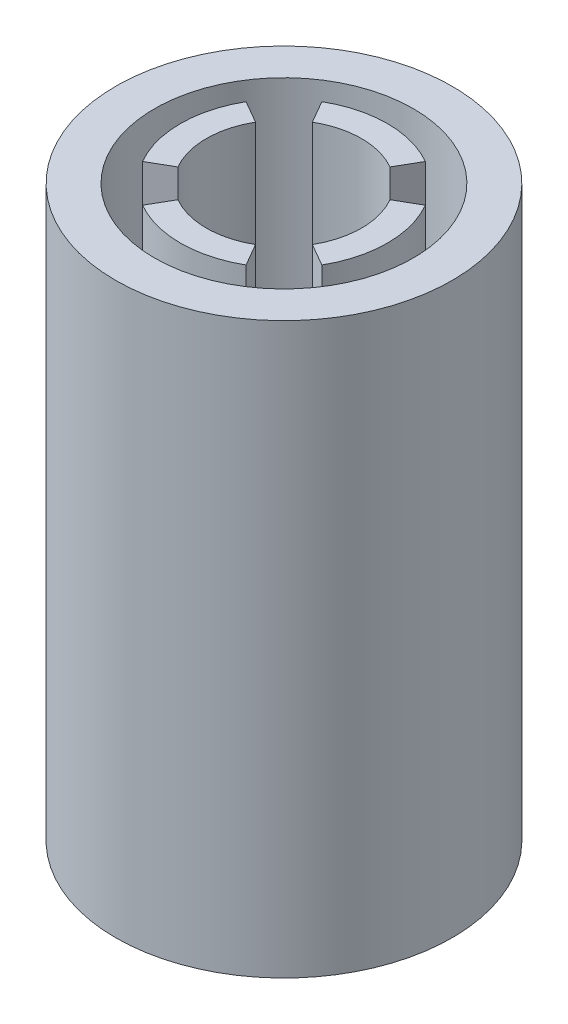
ISO-10303-21;
HEADER;
FILE_DESCRIPTION(('STEP AP214'),'2;1');
FILE_NAME('part.step','',(''),(''),'','','');
FILE_SCHEMA(('AUTOMOTIVE_DESIGN { 1 0 10303 214 1 1 1 1 }'));
ENDSEC;
DATA;
#1=APPLICATION_CONTEXT('core data for automotive mechanical design processes');
#2=APPLICATION_PROTOCOL_DEFINITION('international standard','automotive_design',2000,#1);
#3=PRODUCT_CONTEXT('',#1,'mechanical');
#4=PRODUCT('Part','Part','',(#3));
#5=PRODUCT_RELATED_PRODUCT_CATEGORY('part','',(#4));
#6=PRODUCT_DEFINITION_FORMATION('','',#4);
#7=PRODUCT_DEFINITION_CONTEXT('part definition',#1,'design');
#8=PRODUCT_DEFINITION('design','',#6,#7);
#9=PRODUCT_DEFINITION_SHAPE('','',#8);
#10=(LENGTH_UNIT() NAMED_UNIT(*) SI_UNIT(.MILLI.,.METRE.));
#11=(NAMED_UNIT(*) PLANE_ANGLE_UNIT() SI_UNIT($,.RADIAN.));
#12=(NAMED_UNIT(*) SI_UNIT($,.STERADIAN.) SOLID_ANGLE_UNIT());
#13=UNCERTAINTY_MEASURE_WITH_UNIT(LENGTH_MEASURE(1.E-05),#10,'distance_accuracy_value','');
#14=(GEOMETRIC_REPRESENTATION_CONTEXT(3) GLOBAL_UNCERTAINTY_ASSIGNED_CONTEXT((#13)) GLOBAL_UNIT_ASSIGNED_CONTEXT((#10,
#11,#12)) REPRESENTATION_CONTEXT('',''));
#15=CARTESIAN_POINT('',(0.,0.,0.));
#16=DIRECTION('',(0.,0.,1.));
#17=DIRECTION('',(1.,0.,0.));
#18=AXIS2_PLACEMENT_3D('',#15,#16,#17);
#19=CARTESIAN_POINT('',(0.,22.,0.));
#20=DIRECTION('',(0.,1.,0.));
#21=DIRECTION('',(0.,0.,1.));
#22=AXIS2_PLACEMENT_3D('',#19,#20,#21);
#23=PLANE('',#22);
#24=CARTESIAN_POINT('',(0.,22.,0.));
#25=DIRECTION('',(0.,1.,0.));
#26=DIRECTION('',(0.,0.,1.));
#27=AXIS2_PLACEMENT_3D('',#24,#25,#26);
#28=CIRCLE('',#27,6.5);
#29=CARTESIAN_POINT('',(0.,22.,6.5));
#30=VERTEX_POINT('',#29);
#31=EDGE_CURVE('E11',#30,#30,#28,.T.);
#32=ORIENTED_EDGE('',*,*,#31,.T.);
#33=EDGE_LOOP('',(#32));
#34=FACE_BOUND('',#33,.T.);
#35=CARTESIAN_POINT('',(0.,22.,0.));
#36=DIRECTION('',(0.,1.,0.));
#37=DIRECTION('',(0.,0.,1.));
#38=AXIS2_PLACEMENT_3D('',#35,#36,#37);
#39=CIRCLE('',#38,5.);
#40=CARTESIAN_POINT('',(0.,22.,5.));
#41=VERTEX_POINT('',#40);
#42=EDGE_CURVE('E351',#41,#41,#39,.T.);
#43=ORIENTED_EDGE('',*,*,#42,.F.);
#44=EDGE_LOOP('',(#43));
#45=FACE_BOUND('',#44,.T.);
#46=ADVANCED_FACE('F45',(#34,#45),#23,.T.);
#47=CARTESIAN_POINT('',(0.,22.,0.));
#48=DIRECTION('',(0.,-1.,0.));
#49=DIRECTION('',(0.,0.,-1.));
#50=AXIS2_PLACEMENT_3D('',#47,#48,#49);
#51=CYLINDRICAL_SURFACE('',#50,6.5);
#52=ORIENTED_EDGE('',*,*,#31,.F.);
#53=EDGE_LOOP('',(#52));
#54=FACE_BOUND('',#53,.T.);
#55=CARTESIAN_POINT('',(0.,0.,0.));
#56=DIRECTION('',(0.,1.,0.));
#57=DIRECTION('',(0.,0.,1.));
#58=AXIS2_PLACEMENT_3D('',#55,#56,#57);
#59=CIRCLE('',#58,6.5);
#60=CARTESIAN_POINT('',(0.,0.,6.5));
#61=VERTEX_POINT('',#60);
#62=EDGE_CURVE('E49',#61,#61,#59,.T.);
#63=ORIENTED_EDGE('',*,*,#62,.T.);
#64=EDGE_LOOP('',(#63));
#65=FACE_BOUND('',#64,.T.);
#66=ADVANCED_FACE('F47',(#54,#65),#51,.T.);
#67=CARTESIAN_POINT('',(0.,0.,0.));
#68=DIRECTION('',(0.,1.,0.));
#69=DIRECTION('',(0.,0.,1.));
#70=AXIS2_PLACEMENT_3D('',#67,#68,#69);
#71=PLANE('',#70);
#72=CARTESIAN_POINT('',(0.,0.,-4.5));
#73=DIRECTION('',(0.,1.,0.));
#74=DIRECTION('',(0.,0.,1.));
#75=AXIS2_PLACEMENT_3D('',#72,#73,#74);
#76=CIRCLE('',#75,0.3);
#77=CARTESIAN_POINT('',(0.,0.,-4.2));
#78=VERTEX_POINT('',#77);
#79=EDGE_CURVE('E614',#78,#78,#76,.T.);
#80=ORIENTED_EDGE('',*,*,#79,.T.);
#81=EDGE_LOOP('',(#80));
#82=FACE_BOUND('',#81,.T.);
#83=CARTESIAN_POINT('',(4.5,0.,0.));
#84=DIRECTION('',(0.,1.,0.));
#85=DIRECTION('',(0.,0.,1.));
#86=AXIS2_PLACEMENT_3D('',#83,#84,#85);
#87=CIRCLE('',#86,0.3);
#88=CARTESIAN_POINT('',(4.5,0.,0.3));
#89=VERTEX_POINT('',#88);
#90=EDGE_CURVE('E626',#89,#89,#87,.T.);
#91=ORIENTED_EDGE('',*,*,#90,.T.);
#92=EDGE_LOOP('',(#91));
#93=FACE_BOUND('',#92,.T.);
#94=CARTESIAN_POINT('',(0.,0.,4.5));
#95=DIRECTION('',(0.,1.,0.));
#96=DIRECTION('',(0.,0.,1.));
#97=AXIS2_PLACEMENT_3D('',#94,#95,#96);
#98=CIRCLE('',#97,0.3);
#99=CARTESIAN_POINT('',(0.,0.,4.8));
#100=VERTEX_POINT('',#99);
#101=EDGE_CURVE('E636',#100,#100,#98,.T.);
#102=ORIENTED_EDGE('',*,*,#101,.T.);
#103=EDGE_LOOP('',(#102));
#104=FACE_BOUND('',#103,.T.);
#105=CARTESIAN_POINT('',(-4.5,0.,0.));
#106=DIRECTION('',(0.,1.,0.));
#107=DIRECTION('',(0.,0.,1.));
#108=AXIS2_PLACEMENT_3D('',#105,#106,#107);
#109=CIRCLE('',#108,0.3);
#110=CARTESIAN_POINT('',(-4.5,0.,0.300000000000001));
#111=VERTEX_POINT('',#110);
#112=EDGE_CURVE('E644',#111,#111,#109,.T.);
#113=ORIENTED_EDGE('',*,*,#112,.T.);
#114=EDGE_LOOP('',(#113));
#115=FACE_BOUND('',#114,.T.);
#116=ORIENTED_EDGE('',*,*,#62,.F.);
#117=EDGE_LOOP('',(#116));
#118=FACE_BOUND('',#117,.T.);
#119=ADVANCED_FACE('F374',(#82,#93,#104,#115,#118),#71,.F.);
#120=CARTESIAN_POINT('',(0.,2.,0.));
#121=DIRECTION('',(0.,1.,0.));
#122=DIRECTION('',(0.,0.,1.));
#123=AXIS2_PLACEMENT_3D('',#120,#121,#122);
#124=PLANE('',#123);
#125=CARTESIAN_POINT('',(0.,2.,-4.5));
#126=DIRECTION('',(0.,1.,0.));
#127=DIRECTION('',(0.,0.,1.));
#128=AXIS2_PLACEMENT_3D('',#125,#126,#127);
#129=CIRCLE('',#128,0.3);
#130=CARTESIAN_POINT('',(0.,2.,-4.2));
#131=VERTEX_POINT('',#130);
#132=EDGE_CURVE('E617',#131,#131,#129,.T.);
#133=ORIENTED_EDGE('',*,*,#132,.F.);
#134=EDGE_LOOP('',(#133));
#135=FACE_BOUND('',#134,.T.);
#136=CARTESIAN_POINT('',(4.5,2.,0.));
#137=DIRECTION('',(0.,1.,0.));
#138=DIRECTION('',(0.,0.,1.));
#139=AXIS2_PLACEMENT_3D('',#136,#137,#138);
#140=CIRCLE('',#139,0.3);
#141=CARTESIAN_POINT('',(4.5,2.,0.3));
#142=VERTEX_POINT('',#141);
#143=EDGE_CURVE('E619',#142,#142,#140,.T.);
#144=ORIENTED_EDGE('',*,*,#143,.F.);
#145=EDGE_LOOP('',(#144));
#146=FACE_BOUND('',#145,.T.);
#147=CARTESIAN_POINT('',(0.,2.,4.5));
#148=DIRECTION('',(0.,1.,0.));
#149=DIRECTION('',(0.,0.,1.));
#150=AXIS2_PLACEMENT_3D('',#147,#148,#149);
#151=CIRCLE('',#150,0.3);
#152=CARTESIAN_POINT('',(0.,2.,4.8));
#153=VERTEX_POINT('',#152);
#154=EDGE_CURVE('E632',#153,#153,#151,.T.);
#155=ORIENTED_EDGE('',*,*,#154,.F.);
#156=EDGE_LOOP('',(#155));
#157=FACE_BOUND('',#156,.T.);
#158=CARTESIAN_POINT('',(-4.5,2.,0.));
#159=DIRECTION('',(0.,1.,0.));
#160=DIRECTION('',(0.,0.,1.));
#161=AXIS2_PLACEMENT_3D('',#158,#159,#160);
#162=CIRCLE('',#161,0.3);
#163=CARTESIAN_POINT('',(-4.5,2.,0.300000000000001));
#164=VERTEX_POINT('',#163);
#165=EDGE_CURVE('E640',#164,#164,#162,.T.);
#166=ORIENTED_EDGE('',*,*,#165,.F.);
#167=EDGE_LOOP('',(#166));
#168=FACE_BOUND('',#167,.T.);
#169=CARTESIAN_POINT('',(0.,2.,0.));
#170=DIRECTION('',(0.,-1.,0.));
#171=DIRECTION('',(0.,0.,-1.));
#172=AXIS2_PLACEMENT_3D('',#169,#170,#171);
#173=CIRCLE('',#172,0.75);
#174=CARTESIAN_POINT('',(0.,2.,-0.75));
#175=VERTEX_POINT('',#174);
#176=EDGE_CURVE('E623',#175,#175,#173,.T.);
#177=ORIENTED_EDGE('',*,*,#176,.T.);
#178=EDGE_LOOP('',(#177));
#179=FACE_BOUND('',#178,.T.);
#180=CARTESIAN_POINT('',(0.,2.,0.));
#181=DIRECTION('',(0.,-1.,0.));
#182=DIRECTION('',(0.,0.,-1.));
#183=AXIS2_PLACEMENT_3D('',#180,#181,#182);
#184=CIRCLE('',#183,3.);
#185=CARTESIAN_POINT('',(-2.59807621135326,2.,1.50000000000009));
#186=VERTEX_POINT('',#185);
#187=CARTESIAN_POINT('',(-2.59807621135337,2.,-1.49999999999991));
#188=VERTEX_POINT('',#187);
#189=EDGE_CURVE('E172',#186,#188,#184,.T.);
#190=ORIENTED_EDGE('',*,*,#189,.F.);
#191=DIRECTION('',(0.86602540378449,0.,-0.499999999999911));
#192=VECTOR('',#191,1.);
#193=CARTESIAN_POINT('',(-3.46410161513775,2.,2.));
#194=LINE('',#193,#192);
#195=CARTESIAN_POINT('',(-3.46410161513775,2.,2.));
#196=VERTEX_POINT('',#195);
#197=EDGE_CURVE('E224',#196,#186,#194,.T.);
#198=ORIENTED_EDGE('',*,*,#197,.F.);
#199=CARTESIAN_POINT('',(0.,2.,0.));
#200=DIRECTION('',(0.,1.,0.));
#201=DIRECTION('',(0.,0.,-1.));
#202=AXIS2_PLACEMENT_3D('',#199,#200,#201);
#203=CIRCLE('',#202,4.);
#204=CARTESIAN_POINT('',(-3.46410161513775,2.,-2.));
#205=VERTEX_POINT('',#204);
#206=EDGE_CURVE('E244',#205,#196,#203,.T.);
#207=ORIENTED_EDGE('',*,*,#206,.F.);
#208=DIRECTION('',(-0.866025403784386,0.,-0.500000000000092));
#209=VECTOR('',#208,1.);
#210=CARTESIAN_POINT('',(-2.59807621135337,2.,-1.49999999999991));
#211=LINE('',#210,#209);
#212=EDGE_CURVE('E240',#188,#205,#211,.T.);
#213=ORIENTED_EDGE('',*,*,#212,.F.);
#214=EDGE_LOOP('',(#190,#198,#207,#213));
#215=FACE_BOUND('',#214,.T.);
#216=CARTESIAN_POINT('',(0.,2.,0.));
#217=DIRECTION('',(0.,-1.,0.));
#218=DIRECTION('',(0.,0.,-1.));
#219=AXIS2_PLACEMENT_3D('',#216,#217,#218);
#220=CIRCLE('',#219,3.);
#221=CARTESIAN_POINT('',(-1.5,2.,-2.59807621135331));
#222=VERTEX_POINT('',#221);
#223=CARTESIAN_POINT('',(1.5,2.,-2.59807621135331));
#224=VERTEX_POINT('',#223);
#225=EDGE_CURVE('E307',#222,#224,#220,.T.);
#226=ORIENTED_EDGE('',*,*,#225,.F.);
#227=DIRECTION('',(0.500000000000001,0.,0.866025403784438));
#228=VECTOR('',#227,1.);
#229=CARTESIAN_POINT('',(-2.,2.,-3.46410161513775));
#230=LINE('',#229,#228);
#231=CARTESIAN_POINT('',(-2.,2.,-3.46410161513775));
#232=VERTEX_POINT('',#231);
#233=EDGE_CURVE('E311',#232,#222,#230,.T.);
#234=ORIENTED_EDGE('',*,*,#233,.F.);
#235=CARTESIAN_POINT('',(0.,2.,0.));
#236=DIRECTION('',(0.,1.,0.));
#237=DIRECTION('',(0.,0.,-1.));
#238=AXIS2_PLACEMENT_3D('',#235,#236,#237);
#239=CIRCLE('',#238,4.);
#240=CARTESIAN_POINT('',(2.,2.,-3.46410161513775));
#241=VERTEX_POINT('',#240);
#242=EDGE_CURVE('E331',#241,#232,#239,.T.);
#243=ORIENTED_EDGE('',*,*,#242,.F.);
#244=DIRECTION('',(0.500000000000001,0.,-0.866025403784438));
#245=VECTOR('',#244,1.);
#246=CARTESIAN_POINT('',(1.5,2.,-2.59807621135331));
#247=LINE('',#246,#245);
#248=EDGE_CURVE('E327',#224,#241,#247,.T.);
#249=ORIENTED_EDGE('',*,*,#248,.F.);
#250=EDGE_LOOP('',(#226,#234,#243,#249));
#251=FACE_BOUND('',#250,.T.);
#252=CARTESIAN_POINT('',(0.,2.,0.));
#253=DIRECTION('',(0.,1.,0.));
#254=DIRECTION('',(0.,0.,1.));
#255=AXIS2_PLACEMENT_3D('',#252,#253,#254);
#256=CIRCLE('',#255,5.);
#257=CARTESIAN_POINT('',(0.,2.,5.));
#258=VERTEX_POINT('',#257);
#259=EDGE_CURVE('E350',#258,#258,#256,.T.);
#260=ORIENTED_EDGE('',*,*,#259,.T.);
#261=EDGE_LOOP('',(#260));
#262=FACE_BOUND('',#261,.T.);
#263=CARTESIAN_POINT('',(0.,2.,0.));
#264=DIRECTION('',(0.,-1.,0.));
#265=DIRECTION('',(0.,0.,-1.));
#266=AXIS2_PLACEMENT_3D('',#263,#264,#265);
#267=CIRCLE('',#266,3.);
#268=CARTESIAN_POINT('',(2.59807621135333,2.,-1.49999999999997));
#269=VERTEX_POINT('',#268);
#270=CARTESIAN_POINT('',(2.5980762113533,2.,1.50000000000003));
#271=VERTEX_POINT('',#270);
#272=EDGE_CURVE('E264',#269,#271,#267,.T.);
#273=ORIENTED_EDGE('',*,*,#272,.F.);
#274=DIRECTION('',(-0.866025403784443,0.,0.499999999999992));
#275=VECTOR('',#274,1.);
#276=CARTESIAN_POINT('',(3.46410161513777,2.,-1.99999999999996));
#277=LINE('',#276,#275);
#278=CARTESIAN_POINT('',(3.46410161513777,2.,-1.99999999999996));
#279=VERTEX_POINT('',#278);
#280=EDGE_CURVE('E268',#279,#269,#277,.T.);
#281=ORIENTED_EDGE('',*,*,#280,.F.);
#282=CARTESIAN_POINT('',(0.,2.,0.));
#283=DIRECTION('',(0.,1.,0.));
#284=DIRECTION('',(0.,0.,-1.));
#285=AXIS2_PLACEMENT_3D('',#282,#283,#284);
#286=CIRCLE('',#285,4.);
#287=CARTESIAN_POINT('',(3.46410161513773,2.,2.00000000000004));
#288=VERTEX_POINT('',#287);
#289=EDGE_CURVE('E288',#288,#279,#286,.T.);
#290=ORIENTED_EDGE('',*,*,#289,.F.);
#291=DIRECTION('',(0.866025403784432,0.,0.500000000000011));
#292=VECTOR('',#291,1.);
#293=CARTESIAN_POINT('',(2.5980762113533,2.,1.50000000000003));
#294=LINE('',#293,#292);
#295=EDGE_CURVE('E284',#271,#288,#294,.T.);
#296=ORIENTED_EDGE('',*,*,#295,.F.);
#297=EDGE_LOOP('',(#273,#281,#290,#296));
#298=FACE_BOUND('',#297,.T.);
#299=CARTESIAN_POINT('',(0.,2.,0.));
#300=DIRECTION('',(0.,-1.,0.));
#301=DIRECTION('',(0.,0.,-1.));
#302=AXIS2_PLACEMENT_3D('',#299,#300,#301);
#303=CIRCLE('',#302,3.);
#304=CARTESIAN_POINT('',(1.50000000000002,2.,2.5980762113533));
#305=VERTEX_POINT('',#304);
#306=CARTESIAN_POINT('',(-1.49999999999998,2.,2.59807621135333));
#307=VERTEX_POINT('',#306);
#308=EDGE_CURVE('E168',#305,#307,#303,.T.);
#309=ORIENTED_EDGE('',*,*,#308,.F.);
#310=DIRECTION('',(-0.500000000000008,0.,-0.866025403784434));
#311=VECTOR('',#310,1.);
#312=CARTESIAN_POINT('',(2.00000000000003,2.,3.46410161513774));
#313=LINE('',#312,#311);
#314=CARTESIAN_POINT('',(2.00000000000003,2.,3.46410161513774));
#315=VERTEX_POINT('',#314);
#316=EDGE_CURVE('E189',#315,#305,#313,.T.);
#317=ORIENTED_EDGE('',*,*,#316,.F.);
#318=CARTESIAN_POINT('',(0.,2.,0.));
#319=DIRECTION('',(0.,1.,0.));
#320=DIRECTION('',(0.,0.,-1.));
#321=AXIS2_PLACEMENT_3D('',#318,#319,#320);
#322=CIRCLE('',#321,4.);
#323=CARTESIAN_POINT('',(-1.99999999999998,2.,3.46410161513777));
#324=VERTEX_POINT('',#323);
#325=EDGE_CURVE('E193',#324,#315,#322,.T.);
#326=ORIENTED_EDGE('',*,*,#325,.F.);
#327=DIRECTION('',(-0.499999999999994,0.,0.866025403784442));
#328=VECTOR('',#327,1.);
#329=CARTESIAN_POINT('',(-1.49999999999998,2.,2.59807621135333));
#330=LINE('',#329,#328);
#331=EDGE_CURVE('E206',#307,#324,#330,.T.);
#332=ORIENTED_EDGE('',*,*,#331,.F.);
#333=EDGE_LOOP('',(#309,#317,#326,#332));
#334=FACE_BOUND('',#333,.T.);
#335=ADVANCED_FACE('F359',(#135,#146,#157,#168,#179,#215,#251,#262,#298,#334),#124,.T.);
#336=CARTESIAN_POINT('',(0.,22.,0.));
#337=DIRECTION('',(0.,-1.,0.));
#338=DIRECTION('',(0.,0.,-1.));
#339=AXIS2_PLACEMENT_3D('',#336,#337,#338);
#340=CYLINDRICAL_SURFACE('',#339,5.);
#341=ORIENTED_EDGE('',*,*,#42,.T.);
#342=EDGE_LOOP('',(#341));
#343=FACE_BOUND('',#342,.T.);
#344=ORIENTED_EDGE('',*,*,#259,.F.);
#345=EDGE_LOOP('',(#344));
#346=FACE_BOUND('',#345,.T.);
#347=ADVANCED_FACE('F362',(#343,#346),#340,.F.);
#348=CARTESIAN_POINT('',(0.,22.,0.));
#349=DIRECTION('',(0.,-1.,0.));
#350=DIRECTION('',(0.,0.,-1.));
#351=AXIS2_PLACEMENT_3D('',#348,#349,#350);
#352=CYLINDRICAL_SURFACE('',#351,3.);
#353=ORIENTED_EDGE('',*,*,#225,.T.);
#354=DIRECTION('',(0.,-1.,0.));
#355=VECTOR('',#354,1.);
#356=CARTESIAN_POINT('',(1.5,22.,-2.59807621135331));
#357=LINE('',#356,#355);
#358=CARTESIAN_POINT('',(1.5,22.,-2.59807621135331));
#359=VERTEX_POINT('',#358);
#360=EDGE_CURVE('E346',#359,#224,#357,.T.);
#361=ORIENTED_EDGE('',*,*,#360,.F.);
#362=CARTESIAN_POINT('',(0.,22.,0.));
#363=DIRECTION('',(0.,-1.,0.));
#364=DIRECTION('',(0.,0.,-1.));
#365=AXIS2_PLACEMENT_3D('',#362,#363,#364);
#366=CIRCLE('',#365,3.);
#367=CARTESIAN_POINT('',(-1.5,22.,-2.59807621135331));
#368=VERTEX_POINT('',#367);
#369=EDGE_CURVE('E61',#368,#359,#366,.T.);
#370=ORIENTED_EDGE('',*,*,#369,.F.);
#371=DIRECTION('',(0.,-1.,0.));
#372=VECTOR('',#371,1.);
#373=CARTESIAN_POINT('',(-1.5,22.,-2.59807621135331));
#374=LINE('',#373,#372);
#375=EDGE_CURVE('E323',#368,#222,#374,.T.);
#376=ORIENTED_EDGE('',*,*,#375,.T.);
#377=EDGE_LOOP('',(#353,#361,#370,#376));
#378=FACE_BOUND('',#377,.T.);
#379=ADVANCED_FACE('F364',(#378),#352,.F.);
#380=CARTESIAN_POINT('',(1.5,22.,-2.59807621135331));
#381=DIRECTION('',(-0.866025403784438,0.,-0.500000000000001));
#382=DIRECTION('',(-0.500000000000001,0.,0.866025403784438));
#383=AXIS2_PLACEMENT_3D('',#380,#381,#382);
#384=PLANE('',#383);
#385=ORIENTED_EDGE('',*,*,#248,.T.);
#386=DIRECTION('',(0.,-1.,0.));
#387=VECTOR('',#386,1.);
#388=CARTESIAN_POINT('',(2.,22.,-3.46410161513775));
#389=LINE('',#388,#387);
#390=CARTESIAN_POINT('',(2.,22.,-3.46410161513775));
#391=VERTEX_POINT('',#390);
#392=EDGE_CURVE('E343',#391,#241,#389,.T.);
#393=ORIENTED_EDGE('',*,*,#392,.F.);
#394=DIRECTION('',(0.500000000000001,0.,-0.866025403784438));
#395=VECTOR('',#394,1.);
#396=CARTESIAN_POINT('',(1.5,22.,-2.59807621135331));
#397=LINE('',#396,#395);
#398=EDGE_CURVE('E310',#359,#391,#397,.T.);
#399=ORIENTED_EDGE('',*,*,#398,.F.);
#400=ORIENTED_EDGE('',*,*,#360,.T.);
#401=EDGE_LOOP('',(#385,#393,#399,#400));
#402=FACE_BOUND('',#401,.T.);
#403=ADVANCED_FACE('F371',(#402),#384,.F.);
#404=CARTESIAN_POINT('',(0.,22.,0.));
#405=DIRECTION('',(0.,-1.,0.));
#406=DIRECTION('',(0.,0.,-1.));
#407=AXIS2_PLACEMENT_3D('',#404,#405,#406);
#408=CYLINDRICAL_SURFACE('',#407,4.);
#409=ORIENTED_EDGE('',*,*,#242,.T.);
#410=DIRECTION('',(0.,-1.,0.));
#411=VECTOR('',#410,1.);
#412=CARTESIAN_POINT('',(-2.,22.,-3.46410161513775));
#413=LINE('',#412,#411);
#414=CARTESIAN_POINT('',(-2.,22.,-3.46410161513775));
#415=VERTEX_POINT('',#414);
#416=EDGE_CURVE('E340',#415,#232,#413,.T.);
#417=ORIENTED_EDGE('',*,*,#416,.F.);
#418=CARTESIAN_POINT('',(0.,22.,0.));
#419=DIRECTION('',(0.,1.,0.));
#420=DIRECTION('',(0.,0.,-1.));
#421=AXIS2_PLACEMENT_3D('',#418,#419,#420);
#422=CIRCLE('',#421,4.);
#423=EDGE_CURVE('E315',#391,#415,#422,.T.);
#424=ORIENTED_EDGE('',*,*,#423,.F.);
#425=ORIENTED_EDGE('',*,*,#392,.T.);
#426=EDGE_LOOP('',(#409,#417,#424,#425));
#427=FACE_BOUND('',#426,.T.);
#428=ADVANCED_FACE('F453',(#427),#408,.T.);
#429=CARTESIAN_POINT('',(-2.,22.,-3.46410161513775));
#430=DIRECTION('',(0.866025403784438,0.,-0.500000000000001));
#431=DIRECTION('',(-0.500000000000001,0.,-0.866025403784438));
#432=AXIS2_PLACEMENT_3D('',#429,#430,#431);
#433=PLANE('',#432);
#434=ORIENTED_EDGE('',*,*,#233,.T.);
#435=ORIENTED_EDGE('',*,*,#375,.F.);
#436=DIRECTION('',(0.500000000000001,0.,0.866025403784438));
#437=VECTOR('',#436,1.);
#438=CARTESIAN_POINT('',(-2.,22.,-3.46410161513775));
#439=LINE('',#438,#437);
#440=EDGE_CURVE('E319',#415,#368,#439,.T.);
#441=ORIENTED_EDGE('',*,*,#440,.F.);
#442=ORIENTED_EDGE('',*,*,#416,.T.);
#443=EDGE_LOOP('',(#434,#435,#441,#442));
#444=FACE_BOUND('',#443,.T.);
#445=ADVANCED_FACE('F450',(#444),#433,.F.);
#446=CARTESIAN_POINT('',(0.,22.,0.));
#447=DIRECTION('',(0.,-1.,0.));
#448=DIRECTION('',(0.,0.,-1.));
#449=AXIS2_PLACEMENT_3D('',#446,#447,#448);
#450=CYLINDRICAL_SURFACE('',#449,3.);
#451=ORIENTED_EDGE('',*,*,#272,.T.);
#452=DIRECTION('',(0.,-1.,0.));
#453=VECTOR('',#452,1.);
#454=CARTESIAN_POINT('',(2.5980762113533,22.,1.50000000000003));
#455=LINE('',#454,#453);
#456=CARTESIAN_POINT('',(2.5980762113533,22.,1.50000000000003));
#457=VERTEX_POINT('',#456);
#458=EDGE_CURVE('E303',#457,#271,#455,.T.);
#459=ORIENTED_EDGE('',*,*,#458,.F.);
#460=CARTESIAN_POINT('',(0.,22.,0.));
#461=DIRECTION('',(0.,-1.,0.));
#462=DIRECTION('',(0.,0.,-1.));
#463=AXIS2_PLACEMENT_3D('',#460,#461,#462);
#464=CIRCLE('',#463,3.);
#465=CARTESIAN_POINT('',(2.59807621135333,22.,-1.49999999999997));
#466=VERTEX_POINT('',#465);
#467=EDGE_CURVE('E69',#466,#457,#464,.T.);
#468=ORIENTED_EDGE('',*,*,#467,.F.);
#469=DIRECTION('',(0.,-1.,0.));
#470=VECTOR('',#469,1.);
#471=CARTESIAN_POINT('',(2.59807621135333,22.,-1.49999999999997));
#472=LINE('',#471,#470);
#473=EDGE_CURVE('E280',#466,#269,#472,.T.);
#474=ORIENTED_EDGE('',*,*,#473,.T.);
#475=EDGE_LOOP('',(#451,#459,#468,#474));
#476=FACE_BOUND('',#475,.T.);
#477=ADVANCED_FACE('F446',(#476),#450,.F.);
#478=CARTESIAN_POINT('',(2.5980762113533,22.,1.50000000000003));
#479=DIRECTION('',(0.500000000000011,0.,-0.866025403784432));
#480=DIRECTION('',(-0.866025403784432,0.,-0.500000000000011));
#481=AXIS2_PLACEMENT_3D('',#478,#479,#480);
#482=PLANE('',#481);
#483=ORIENTED_EDGE('',*,*,#295,.T.);
#484=DIRECTION('',(0.,-1.,0.));
#485=VECTOR('',#484,1.);
#486=CARTESIAN_POINT('',(3.46410161513773,22.,2.00000000000004));
#487=LINE('',#486,#485);
#488=CARTESIAN_POINT('',(3.46410161513773,22.,2.00000000000004));
#489=VERTEX_POINT('',#488);
#490=EDGE_CURVE('E300',#489,#288,#487,.T.);
#491=ORIENTED_EDGE('',*,*,#490,.F.);
#492=DIRECTION('',(0.866025403784432,0.,0.500000000000011));
#493=VECTOR('',#492,1.);
#494=CARTESIAN_POINT('',(2.5980762113533,22.,1.50000000000003));
#495=LINE('',#494,#493);
#496=EDGE_CURVE('E267',#457,#489,#495,.T.);
#497=ORIENTED_EDGE('',*,*,#496,.F.);
#498=ORIENTED_EDGE('',*,*,#458,.T.);
#499=EDGE_LOOP('',(#483,#491,#497,#498));
#500=FACE_BOUND('',#499,.T.);
#501=ADVANCED_FACE('F442',(#500),#482,.F.);
#502=CARTESIAN_POINT('',(0.,22.,0.));
#503=DIRECTION('',(0.,-1.,0.));
#504=DIRECTION('',(0.,0.,-1.));
#505=AXIS2_PLACEMENT_3D('',#502,#503,#504);
#506=CYLINDRICAL_SURFACE('',#505,4.);
#507=ORIENTED_EDGE('',*,*,#289,.T.);
#508=DIRECTION('',(0.,-1.,0.));
#509=VECTOR('',#508,1.);
#510=CARTESIAN_POINT('',(3.46410161513777,22.,-1.99999999999996));
#511=LINE('',#510,#509);
#512=CARTESIAN_POINT('',(3.46410161513777,22.,-1.99999999999996));
#513=VERTEX_POINT('',#512);
#514=EDGE_CURVE('E297',#513,#279,#511,.T.);
#515=ORIENTED_EDGE('',*,*,#514,.F.);
#516=CARTESIAN_POINT('',(0.,22.,0.));
#517=DIRECTION('',(0.,1.,0.));
#518=DIRECTION('',(0.,0.,-1.));
#519=AXIS2_PLACEMENT_3D('',#516,#517,#518);
#520=CIRCLE('',#519,4.);
#521=EDGE_CURVE('E272',#489,#513,#520,.T.);
#522=ORIENTED_EDGE('',*,*,#521,.F.);
#523=ORIENTED_EDGE('',*,*,#490,.T.);
#524=EDGE_LOOP('',(#507,#515,#522,#523));
#525=FACE_BOUND('',#524,.T.);
#526=ADVANCED_FACE('F438',(#525),#506,.T.);
#527=CARTESIAN_POINT('',(3.46410161513777,22.,-1.99999999999996));
#528=DIRECTION('',(0.499999999999992,0.,0.866025403784443));
#529=DIRECTION('',(0.866025403784443,0.,-0.499999999999992));
#530=AXIS2_PLACEMENT_3D('',#527,#528,#529);
#531=PLANE('',#530);
#532=ORIENTED_EDGE('',*,*,#280,.T.);
#533=ORIENTED_EDGE('',*,*,#473,.F.);
#534=DIRECTION('',(-0.866025403784443,0.,0.499999999999992));
#535=VECTOR('',#534,1.);
#536=CARTESIAN_POINT('',(3.46410161513777,22.,-1.99999999999996));
#537=LINE('',#536,#535);
#538=EDGE_CURVE('E276',#513,#466,#537,.T.);
#539=ORIENTED_EDGE('',*,*,#538,.F.);
#540=ORIENTED_EDGE('',*,*,#514,.T.);
#541=EDGE_LOOP('',(#532,#533,#539,#540));
#542=FACE_BOUND('',#541,.T.);
#543=ADVANCED_FACE('F432',(#542),#531,.F.);
#544=CARTESIAN_POINT('',(0.,22.,0.));
#545=DIRECTION('',(0.,-1.,0.));
#546=DIRECTION('',(0.,0.,-1.));
#547=AXIS2_PLACEMENT_3D('',#544,#545,#546);
#548=CYLINDRICAL_SURFACE('',#547,3.);
#549=ORIENTED_EDGE('',*,*,#189,.T.);
#550=DIRECTION('',(0.,-1.,0.));
#551=VECTOR('',#550,1.);
#552=CARTESIAN_POINT('',(-2.59807621135337,22.,-1.49999999999991));
#553=LINE('',#552,#551);
#554=CARTESIAN_POINT('',(-2.59807621135337,22.,-1.49999999999991));
#555=VERTEX_POINT('',#554);
#556=EDGE_CURVE('E260',#555,#188,#553,.T.);
#557=ORIENTED_EDGE('',*,*,#556,.F.);
#558=CARTESIAN_POINT('',(0.,22.,0.));
#559=DIRECTION('',(0.,-1.,0.));
#560=DIRECTION('',(0.,0.,-1.));
#561=AXIS2_PLACEMENT_3D('',#558,#559,#560);
#562=CIRCLE('',#561,3.);
#563=CARTESIAN_POINT('',(-2.59807621135326,22.,1.50000000000009));
#564=VERTEX_POINT('',#563);
#565=EDGE_CURVE('E219',#564,#555,#562,.T.);
#566=ORIENTED_EDGE('',*,*,#565,.F.);
#567=DIRECTION('',(0.,-1.,0.));
#568=VECTOR('',#567,1.);
#569=CARTESIAN_POINT('',(-2.59807621135326,22.,1.50000000000009));
#570=LINE('',#569,#568);
#571=EDGE_CURVE('E236',#564,#186,#570,.T.);
#572=ORIENTED_EDGE('',*,*,#571,.T.);
#573=EDGE_LOOP('',(#549,#557,#566,#572));
#574=FACE_BOUND('',#573,.T.);
#575=ADVANCED_FACE('F413',(#574),#548,.F.);
#576=CARTESIAN_POINT('',(-2.59807621135337,22.,-1.49999999999991));
#577=DIRECTION('',(-0.500000000000091,0.,0.866025403784386));
#578=DIRECTION('',(0.866025403784386,0.,0.500000000000092));
#579=AXIS2_PLACEMENT_3D('',#576,#577,#578);
#580=PLANE('',#579);
#581=ORIENTED_EDGE('',*,*,#212,.T.);
#582=DIRECTION('',(0.,-1.,0.));
#583=VECTOR('',#582,1.);
#584=CARTESIAN_POINT('',(-3.46410161513775,22.,-2.));
#585=LINE('',#584,#583);
#586=CARTESIAN_POINT('',(-3.46410161513775,22.,-2.));
#587=VERTEX_POINT('',#586);
#588=EDGE_CURVE('E257',#587,#205,#585,.T.);
#589=ORIENTED_EDGE('',*,*,#588,.F.);
#590=DIRECTION('',(-0.866025403784386,0.,-0.500000000000092));
#591=VECTOR('',#590,1.);
#592=CARTESIAN_POINT('',(-2.59807621135337,22.,-1.49999999999991));
#593=LINE('',#592,#591);
#594=EDGE_CURVE('E223',#555,#587,#593,.T.);
#595=ORIENTED_EDGE('',*,*,#594,.F.);
#596=ORIENTED_EDGE('',*,*,#556,.T.);
#597=EDGE_LOOP('',(#581,#589,#595,#596));
#598=FACE_BOUND('',#597,.T.);
#599=ADVANCED_FACE('F424',(#598),#580,.F.);
#600=CARTESIAN_POINT('',(0.,22.,0.));
#601=DIRECTION('',(0.,-1.,0.));
#602=DIRECTION('',(0.,0.,-1.));
#603=AXIS2_PLACEMENT_3D('',#600,#601,#602);
#604=CYLINDRICAL_SURFACE('',#603,4.);
#605=ORIENTED_EDGE('',*,*,#206,.T.);
#606=DIRECTION('',(0.,-1.,0.));
#607=VECTOR('',#606,1.);
#608=CARTESIAN_POINT('',(-3.46410161513775,22.,2.));
#609=LINE('',#608,#607);
#610=CARTESIAN_POINT('',(-3.46410161513775,22.,2.));
#611=VERTEX_POINT('',#610);
#612=EDGE_CURVE('E254',#611,#196,#609,.T.);
#613=ORIENTED_EDGE('',*,*,#612,.F.);
#614=CARTESIAN_POINT('',(0.,22.,0.));
#615=DIRECTION('',(0.,1.,0.));
#616=DIRECTION('',(0.,0.,-1.));
#617=AXIS2_PLACEMENT_3D('',#614,#615,#616);
#618=CIRCLE('',#617,4.);
#619=EDGE_CURVE('E228',#587,#611,#618,.T.);
#620=ORIENTED_EDGE('',*,*,#619,.F.);
#621=ORIENTED_EDGE('',*,*,#588,.T.);
#622=EDGE_LOOP('',(#605,#613,#620,#621));
#623=FACE_BOUND('',#622,.T.);
#624=ADVANCED_FACE('F421',(#623),#604,.T.);
#625=CARTESIAN_POINT('',(-3.46410161513775,22.,2.));
#626=DIRECTION('',(-0.499999999999911,0.,-0.86602540378449));
#627=DIRECTION('',(-0.86602540378449,0.,0.499999999999911));
#628=AXIS2_PLACEMENT_3D('',#625,#626,#627);
#629=PLANE('',#628);
#630=ORIENTED_EDGE('',*,*,#197,.T.);
#631=ORIENTED_EDGE('',*,*,#571,.F.);
#632=DIRECTION('',(0.86602540378449,0.,-0.499999999999911));
#633=VECTOR('',#632,1.);
#634=CARTESIAN_POINT('',(-3.46410161513775,22.,2.));
#635=LINE('',#634,#633);
#636=EDGE_CURVE('E232',#611,#564,#635,.T.);
#637=ORIENTED_EDGE('',*,*,#636,.F.);
#638=ORIENTED_EDGE('',*,*,#612,.T.);
#639=EDGE_LOOP('',(#630,#631,#637,#638));
#640=FACE_BOUND('',#639,.T.);
#641=ADVANCED_FACE('F415',(#640),#629,.F.);
#642=CARTESIAN_POINT('',(0.,22.,0.));
#643=DIRECTION('',(0.,-1.,0.));
#644=DIRECTION('',(0.,0.,-1.));
#645=AXIS2_PLACEMENT_3D('',#642,#643,#644);
#646=CYLINDRICAL_SURFACE('',#645,3.);
#647=ORIENTED_EDGE('',*,*,#308,.T.);
#648=DIRECTION('',(0.,-1.,0.));
#649=VECTOR('',#648,1.);
#650=CARTESIAN_POINT('',(-1.49999999999998,22.,2.59807621135333));
#651=LINE('',#650,#649);
#652=CARTESIAN_POINT('',(-1.49999999999998,22.,2.59807621135333));
#653=VERTEX_POINT('',#652);
#654=EDGE_CURVE('E161',#653,#307,#651,.T.);
#655=ORIENTED_EDGE('',*,*,#654,.F.);
#656=CARTESIAN_POINT('',(0.,22.,0.));
#657=DIRECTION('',(0.,-1.,0.));
#658=DIRECTION('',(0.,0.,-1.));
#659=AXIS2_PLACEMENT_3D('',#656,#657,#658);
#660=CIRCLE('',#659,3.);
#661=CARTESIAN_POINT('',(1.50000000000002,22.,2.5980762113533));
#662=VERTEX_POINT('',#661);
#663=EDGE_CURVE('E166',#662,#653,#660,.T.);
#664=ORIENTED_EDGE('',*,*,#663,.F.);
#665=DIRECTION('',(0.,-1.,0.));
#666=VECTOR('',#665,1.);
#667=CARTESIAN_POINT('',(1.50000000000002,22.,2.5980762113533));
#668=LINE('',#667,#666);
#669=EDGE_CURVE('E203',#662,#305,#668,.T.);
#670=ORIENTED_EDGE('',*,*,#669,.T.);
#671=EDGE_LOOP('',(#647,#655,#664,#670));
#672=FACE_BOUND('',#671,.T.);
#673=ADVANCED_FACE('F163',(#672),#646,.F.);
#674=CARTESIAN_POINT('',(-1.49999999999998,22.,2.59807621135333));
#675=DIRECTION('',(0.866025403784442,0.,0.499999999999994));
#676=DIRECTION('',(0.499999999999994,0.,-0.866025403784442));
#677=AXIS2_PLACEMENT_3D('',#674,#675,#676);
#678=PLANE('',#677);
#679=ORIENTED_EDGE('',*,*,#331,.T.);
#680=DIRECTION('',(0.,-1.,0.));
#681=VECTOR('',#680,1.);
#682=CARTESIAN_POINT('',(-1.99999999999998,22.,3.46410161513777));
#683=LINE('',#682,#681);
#684=CARTESIAN_POINT('',(-1.99999999999998,22.,3.46410161513777));
#685=VERTEX_POINT('',#684);
#686=EDGE_CURVE('E173',#685,#324,#683,.T.);
#687=ORIENTED_EDGE('',*,*,#686,.F.);
#688=DIRECTION('',(-0.499999999999994,0.,0.866025403784442));
#689=VECTOR('',#688,1.);
#690=CARTESIAN_POINT('',(-1.49999999999998,22.,2.59807621135333));
#691=LINE('',#690,#689);
#692=EDGE_CURVE('E176',#653,#685,#691,.T.);
#693=ORIENTED_EDGE('',*,*,#692,.F.);
#694=ORIENTED_EDGE('',*,*,#654,.T.);
#695=EDGE_LOOP('',(#679,#687,#693,#694));
#696=FACE_BOUND('',#695,.T.);
#697=ADVANCED_FACE('F177',(#696),#678,.F.);
#698=CARTESIAN_POINT('',(0.,22.,0.));
#699=DIRECTION('',(0.,-1.,0.));
#700=DIRECTION('',(0.,0.,-1.));
#701=AXIS2_PLACEMENT_3D('',#698,#699,#700);
#702=CYLINDRICAL_SURFACE('',#701,4.);
#703=ORIENTED_EDGE('',*,*,#325,.T.);
#704=DIRECTION('',(0.,-1.,0.));
#705=VECTOR('',#704,1.);
#706=CARTESIAN_POINT('',(2.00000000000003,22.,3.46410161513774));
#707=LINE('',#706,#705);
#708=CARTESIAN_POINT('',(2.00000000000003,22.,3.46410161513774));
#709=VERTEX_POINT('',#708);
#710=EDGE_CURVE('E214',#709,#315,#707,.T.);
#711=ORIENTED_EDGE('',*,*,#710,.F.);
#712=CARTESIAN_POINT('',(0.,22.,0.));
#713=DIRECTION('',(0.,1.,0.));
#714=DIRECTION('',(0.,0.,-1.));
#715=AXIS2_PLACEMENT_3D('',#712,#713,#714);
#716=CIRCLE('',#715,4.);
#717=EDGE_CURVE('E182',#685,#709,#716,.T.);
#718=ORIENTED_EDGE('',*,*,#717,.F.);
#719=ORIENTED_EDGE('',*,*,#686,.T.);
#720=EDGE_LOOP('',(#703,#711,#718,#719));
#721=FACE_BOUND('',#720,.T.);
#722=ADVANCED_FACE('F539',(#721),#702,.T.);
#723=CARTESIAN_POINT('',(2.00000000000003,22.,3.46410161513774));
#724=DIRECTION('',(-0.866025403784434,0.,0.500000000000008));
#725=DIRECTION('',(0.500000000000008,0.,0.866025403784434));
#726=AXIS2_PLACEMENT_3D('',#723,#724,#725);
#727=PLANE('',#726);
#728=ORIENTED_EDGE('',*,*,#316,.T.);
#729=ORIENTED_EDGE('',*,*,#669,.F.);
#730=DIRECTION('',(-0.500000000000008,0.,-0.866025403784434));
#731=VECTOR('',#730,1.);
#732=CARTESIAN_POINT('',(2.00000000000003,22.,3.46410161513774));
#733=LINE('',#732,#731);
#734=EDGE_CURVE('E187',#709,#662,#733,.T.);
#735=ORIENTED_EDGE('',*,*,#734,.F.);
#736=ORIENTED_EDGE('',*,*,#710,.T.);
#737=EDGE_LOOP('',(#728,#729,#735,#736));
#738=FACE_BOUND('',#737,.T.);
#739=ADVANCED_FACE('F548',(#738),#727,.F.);
#740=CARTESIAN_POINT('',(0.,17.,0.));
#741=DIRECTION('',(0.,1.,0.));
#742=DIRECTION('',(0.,0.,1.));
#743=AXIS2_PLACEMENT_3D('',#740,#741,#742);
#744=PLANE('',#743);
#745=CARTESIAN_POINT('',(0.,17.,0.));
#746=DIRECTION('',(0.,1.,0.));
#747=DIRECTION('',(0.,0.,1.));
#748=AXIS2_PLACEMENT_3D('',#745,#746,#747);
#749=CIRCLE('',#748,0.75);
#750=CARTESIAN_POINT('',(0.,17.,0.75));
#751=VERTEX_POINT('',#750);
#752=EDGE_CURVE('E196',#751,#751,#749,.F.);
#753=ORIENTED_EDGE('',*,*,#752,.F.);
#754=EDGE_LOOP('',(#753));
#755=FACE_BOUND('',#754,.T.);
#756=ADVANCED_FACE('F406',(#755),#744,.T.);
#757=CARTESIAN_POINT('',(0.,24.1213203435596,0.));
#758=DIRECTION('',(0.,-1.,0.));
#759=DIRECTION('',(0.,0.,-1.));
#760=AXIS2_PLACEMENT_3D('',#757,#758,#759);
#761=CYLINDRICAL_SURFACE('',#760,0.75);
#762=ORIENTED_EDGE('',*,*,#176,.F.);
#763=EDGE_LOOP('',(#762));
#764=FACE_BOUND('',#763,.T.);
#765=ORIENTED_EDGE('',*,*,#752,.T.);
#766=EDGE_LOOP('',(#765));
#767=FACE_BOUND('',#766,.T.);
#768=ADVANCED_FACE('F399',(#764,#767),#761,.T.);
#769=ORIENTED_EDGE('',*,*,#565,.T.);
#770=ORIENTED_EDGE('',*,*,#594,.T.);
#771=ORIENTED_EDGE('',*,*,#619,.T.);
#772=ORIENTED_EDGE('',*,*,#636,.T.);
#773=EDGE_LOOP('',(#769,#770,#771,#772));
#774=FACE_BOUND('',#773,.T.);
#775=ADVANCED_FACE('F390',(#774),#23,.T.);
#776=ORIENTED_EDGE('',*,*,#467,.T.);
#777=ORIENTED_EDGE('',*,*,#496,.T.);
#778=ORIENTED_EDGE('',*,*,#521,.T.);
#779=ORIENTED_EDGE('',*,*,#538,.T.);
#780=EDGE_LOOP('',(#776,#777,#778,#779));
#781=FACE_BOUND('',#780,.T.);
#782=ADVANCED_FACE('F386',(#781),#23,.T.);
#783=ORIENTED_EDGE('',*,*,#369,.T.);
#784=ORIENTED_EDGE('',*,*,#398,.T.);
#785=ORIENTED_EDGE('',*,*,#423,.T.);
#786=ORIENTED_EDGE('',*,*,#440,.T.);
#787=EDGE_LOOP('',(#783,#784,#785,#786));
#788=FACE_BOUND('',#787,.T.);
#789=ADVANCED_FACE('F379',(#788),#23,.T.);
#790=ORIENTED_EDGE('',*,*,#663,.T.);
#791=ORIENTED_EDGE('',*,*,#692,.T.);
#792=ORIENTED_EDGE('',*,*,#717,.T.);
#793=ORIENTED_EDGE('',*,*,#734,.T.);
#794=EDGE_LOOP('',(#790,#791,#792,#793));
#795=FACE_BOUND('',#794,.T.);
#796=ADVANCED_FACE('F185',(#795),#23,.T.);
#797=CARTESIAN_POINT('',(-4.5,0.,0.));
#798=DIRECTION('',(0.,1.,0.));
#799=DIRECTION('',(0.,0.,1.));
#800=AXIS2_PLACEMENT_3D('',#797,#798,#799);
#801=CYLINDRICAL_SURFACE('',#800,0.3);
#802=ORIENTED_EDGE('',*,*,#112,.F.);
#803=EDGE_LOOP('',(#802));
#804=FACE_BOUND('',#803,.T.);
#805=ORIENTED_EDGE('',*,*,#165,.T.);
#806=EDGE_LOOP('',(#805));
#807=FACE_BOUND('',#806,.T.);
#808=ADVANCED_FACE('F389',(#804,#807),#801,.F.);
#809=CARTESIAN_POINT('',(0.,0.,4.5));
#810=DIRECTION('',(0.,1.,0.));
#811=DIRECTION('',(0.,0.,1.));
#812=AXIS2_PLACEMENT_3D('',#809,#810,#811);
#813=CYLINDRICAL_SURFACE('',#812,0.3);
#814=ORIENTED_EDGE('',*,*,#101,.F.);
#815=EDGE_LOOP('',(#814));
#816=FACE_BOUND('',#815,.T.);
#817=ORIENTED_EDGE('',*,*,#154,.T.);
#818=EDGE_LOOP('',(#817));
#819=FACE_BOUND('',#818,.T.);
#820=ADVANCED_FACE('F395',(#816,#819),#813,.F.);
#821=CARTESIAN_POINT('',(4.5,0.,0.));
#822=DIRECTION('',(0.,1.,0.));
#823=DIRECTION('',(0.,0.,1.));
#824=AXIS2_PLACEMENT_3D('',#821,#822,#823);
#825=CYLINDRICAL_SURFACE('',#824,0.3);
#826=ORIENTED_EDGE('',*,*,#90,.F.);
#827=EDGE_LOOP('',(#826));
#828=FACE_BOUND('',#827,.T.);
#829=ORIENTED_EDGE('',*,*,#143,.T.);
#830=EDGE_LOOP('',(#829));
#831=FACE_BOUND('',#830,.T.);
#832=ADVANCED_FACE('F588',(#828,#831),#825,.F.);
#833=CARTESIAN_POINT('',(0.,0.,-4.5));
#834=DIRECTION('',(0.,1.,0.));
#835=DIRECTION('',(0.,0.,1.));
#836=AXIS2_PLACEMENT_3D('',#833,#834,#835);
#837=CYLINDRICAL_SURFACE('',#836,0.3);
#838=ORIENTED_EDGE('',*,*,#79,.F.);
#839=EDGE_LOOP('',(#838));
#840=FACE_BOUND('',#839,.T.);
#841=ORIENTED_EDGE('',*,*,#132,.T.);
#842=EDGE_LOOP('',(#841));
#843=FACE_BOUND('',#842,.T.);
#844=ADVANCED_FACE('F598',(#840,#843),#837,.F.);
#845=CLOSED_SHELL('',(#46,#66,#119,#335,#347,#379,#403,#428,#445,#477,#501,#526,#543,#575,#599,
#624,#641,#673,#697,#722,#739,#756,#768,#775,#782,#789,#796,#808,#820,#832,#844));
#846=MANIFOLD_SOLID_BREP('B2',#845);
#847=ADVANCED_BREP_SHAPE_REPRESENTATION('',(#18,#846),#14);
#848=SHAPE_DEFINITION_REPRESENTATION(#9,#847);
ENDSEC;
END-ISO-10303-21;
